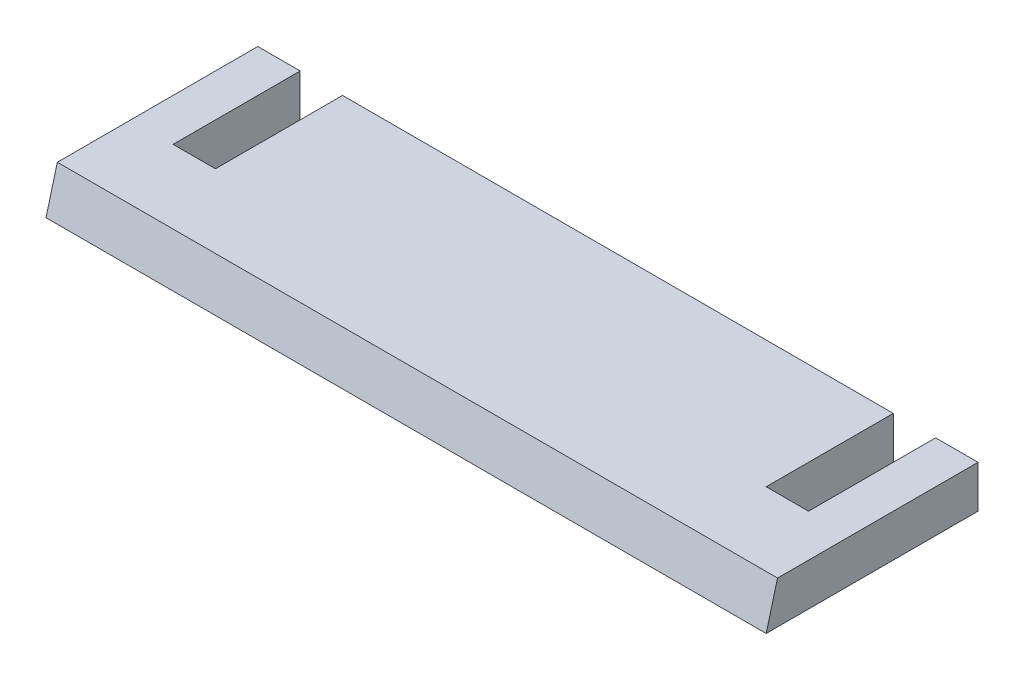
ISO-10303-21;
HEADER;
FILE_DESCRIPTION(('STEP AP214'),'2;1');
FILE_NAME('part.step','',(''),(''),'','','');
FILE_SCHEMA(('AUTOMOTIVE_DESIGN { 1 0 10303 214 1 1 1 1 }'));
ENDSEC;
DATA;
#1=APPLICATION_CONTEXT('core data for automotive mechanical design processes');
#2=APPLICATION_PROTOCOL_DEFINITION('international standard','automotive_design',2000,#1);
#3=PRODUCT_CONTEXT('',#1,'mechanical');
#4=PRODUCT('Part','Part','',(#3));
#5=PRODUCT_RELATED_PRODUCT_CATEGORY('part','',(#4));
#6=PRODUCT_DEFINITION_FORMATION('','',#4);
#7=PRODUCT_DEFINITION_CONTEXT('part definition',#1,'design');
#8=PRODUCT_DEFINITION('design','',#6,#7);
#9=PRODUCT_DEFINITION_SHAPE('','',#8);
#10=(LENGTH_UNIT() NAMED_UNIT(*) SI_UNIT(.MILLI.,.METRE.));
#11=(NAMED_UNIT(*) PLANE_ANGLE_UNIT() SI_UNIT($,.RADIAN.));
#12=(NAMED_UNIT(*) SI_UNIT($,.STERADIAN.) SOLID_ANGLE_UNIT());
#13=UNCERTAINTY_MEASURE_WITH_UNIT(LENGTH_MEASURE(1.E-05),#10,'distance_accuracy_value','');
#14=(GEOMETRIC_REPRESENTATION_CONTEXT(3) GLOBAL_UNCERTAINTY_ASSIGNED_CONTEXT((#13)) GLOBAL_UNIT_ASSIGNED_CONTEXT((#10,
#11,#12)) REPRESENTATION_CONTEXT('',''));
#15=CARTESIAN_POINT('',(0.,0.,0.));
#16=DIRECTION('',(0.,0.,1.));
#17=DIRECTION('',(1.,0.,0.));
#18=AXIS2_PLACEMENT_3D('',#15,#16,#17);
#19=CARTESIAN_POINT('',(85.,10.,-25.));
#20=DIRECTION('',(-1.,0.,0.));
#21=DIRECTION('',(0.,0.,1.));
#22=AXIS2_PLACEMENT_3D('',#19,#20,#21);
#23=PLANE('',#22);
#24=DIRECTION('',(0.,0.,-1.));
#25=VECTOR('',#24,1.);
#26=CARTESIAN_POINT('',(85.,0.,-25.));
#27=LINE('',#26,#25);
#28=CARTESIAN_POINT('',(85.,0.,25.));
#29=VERTEX_POINT('',#28);
#30=CARTESIAN_POINT('',(85.,0.,-25.));
#31=VERTEX_POINT('',#30);
#32=EDGE_CURVE('E151',#29,#31,#27,.T.);
#33=ORIENTED_EDGE('',*,*,#32,.T.);
#34=DIRECTION('',(0.,-1.,0.));
#35=VECTOR('',#34,1.);
#36=CARTESIAN_POINT('',(85.,10.,-25.));
#37=LINE('',#36,#35);
#38=CARTESIAN_POINT('',(85.,10.,-25.));
#39=VERTEX_POINT('',#38);
#40=EDGE_CURVE('E11',#39,#31,#37,.T.);
#41=ORIENTED_EDGE('',*,*,#40,.F.);
#42=DIRECTION('',(0.,0.,-1.));
#43=VECTOR('',#42,1.);
#44=CARTESIAN_POINT('',(85.,10.,-25.));
#45=LINE('',#44,#43);
#46=CARTESIAN_POINT('',(85.,10.,22.3205080756888));
#47=VERTEX_POINT('',#46);
#48=EDGE_CURVE('E141',#47,#39,#45,.T.);
#49=ORIENTED_EDGE('',*,*,#48,.F.);
#50=DIRECTION('',(0.,0.965925826289068,-0.258819045102521));
#51=VECTOR('',#50,1.);
#52=CARTESIAN_POINT('',(85.,21.8301270189222,19.1506350946109));
#53=LINE('',#52,#51);
#54=EDGE_CURVE('E46',#47,#29,#53,.F.);
#55=ORIENTED_EDGE('',*,*,#54,.T.);
#56=EDGE_LOOP('',(#33,#41,#49,#55));
#57=FACE_BOUND('',#56,.T.);
#58=ADVANCED_FACE('F42',(#57),#23,.F.);
#59=CARTESIAN_POINT('',(75.,10.,-25.));
#60=DIRECTION('',(0.,0.,1.));
#61=DIRECTION('',(1.,0.,0.));
#62=AXIS2_PLACEMENT_3D('',#59,#60,#61);
#63=PLANE('',#62);
#64=DIRECTION('',(-1.,0.,0.));
#65=VECTOR('',#64,1.);
#66=CARTESIAN_POINT('',(75.,0.,-25.));
#67=LINE('',#66,#65);
#68=CARTESIAN_POINT('',(75.,0.,-25.));
#69=VERTEX_POINT('',#68);
#70=EDGE_CURVE('E155',#31,#69,#67,.T.);
#71=ORIENTED_EDGE('',*,*,#70,.T.);
#72=DIRECTION('',(0.,-1.,0.));
#73=VECTOR('',#72,1.);
#74=CARTESIAN_POINT('',(75.,10.,-25.));
#75=LINE('',#74,#73);
#76=CARTESIAN_POINT('',(75.,10.,-25.));
#77=VERTEX_POINT('',#76);
#78=EDGE_CURVE('E52',#77,#69,#75,.T.);
#79=ORIENTED_EDGE('',*,*,#78,.F.);
#80=DIRECTION('',(-1.,0.,0.));
#81=VECTOR('',#80,1.);
#82=CARTESIAN_POINT('',(75.,10.,-25.));
#83=LINE('',#82,#81);
#84=EDGE_CURVE('E133',#39,#77,#83,.T.);
#85=ORIENTED_EDGE('',*,*,#84,.F.);
#86=ORIENTED_EDGE('',*,*,#40,.T.);
#87=EDGE_LOOP('',(#71,#79,#85,#86));
#88=FACE_BOUND('',#87,.T.);
#89=ADVANCED_FACE('F134',(#88),#63,.F.);
#90=CARTESIAN_POINT('',(75.,10.,-25.));
#91=DIRECTION('',(1.,0.,0.));
#92=DIRECTION('',(0.,0.,-1.));
#93=AXIS2_PLACEMENT_3D('',#90,#91,#92);
#94=PLANE('',#93);
#95=DIRECTION('',(0.,0.,1.));
#96=VECTOR('',#95,1.);
#97=CARTESIAN_POINT('',(75.,0.,-25.));
#98=LINE('',#97,#96);
#99=CARTESIAN_POINT('',(75.,0.,4.99999999999999));
#100=VERTEX_POINT('',#99);
#101=EDGE_CURVE('E158',#69,#100,#98,.T.);
#102=ORIENTED_EDGE('',*,*,#101,.T.);
#103=DIRECTION('',(0.,-1.,0.));
#104=VECTOR('',#103,1.);
#105=CARTESIAN_POINT('',(75.,10.,4.99999999999999));
#106=LINE('',#105,#104);
#107=CARTESIAN_POINT('',(75.,10.,4.99999999999999));
#108=VERTEX_POINT('',#107);
#109=EDGE_CURVE('E220',#108,#100,#106,.T.);
#110=ORIENTED_EDGE('',*,*,#109,.F.);
#111=DIRECTION('',(0.,0.,1.));
#112=VECTOR('',#111,1.);
#113=CARTESIAN_POINT('',(75.,10.,-25.));
#114=LINE('',#113,#112);
#115=EDGE_CURVE('E140',#77,#108,#114,.T.);
#116=ORIENTED_EDGE('',*,*,#115,.F.);
#117=ORIENTED_EDGE('',*,*,#78,.T.);
#118=EDGE_LOOP('',(#102,#110,#116,#117));
#119=FACE_BOUND('',#118,.T.);
#120=ADVANCED_FACE('F259',(#119),#94,.F.);
#121=CARTESIAN_POINT('',(75.,10.,4.99999999999999));
#122=DIRECTION('',(0.,0.,1.));
#123=DIRECTION('',(1.,0.,0.));
#124=AXIS2_PLACEMENT_3D('',#121,#122,#123);
#125=PLANE('',#124);
#126=DIRECTION('',(-1.,0.,0.));
#127=VECTOR('',#126,1.);
#128=CARTESIAN_POINT('',(75.,0.,4.99999999999999));
#129=LINE('',#128,#127);
#130=CARTESIAN_POINT('',(65.,0.,4.99999999999999));
#131=VERTEX_POINT('',#130);
#132=EDGE_CURVE('E165',#100,#131,#129,.T.);
#133=ORIENTED_EDGE('',*,*,#132,.T.);
#134=DIRECTION('',(0.,-1.,0.));
#135=VECTOR('',#134,1.);
#136=CARTESIAN_POINT('',(65.,10.,4.99999999999999));
#137=LINE('',#136,#135);
#138=CARTESIAN_POINT('',(65.,10.,4.99999999999999));
#139=VERTEX_POINT('',#138);
#140=EDGE_CURVE('E216',#139,#131,#137,.T.);
#141=ORIENTED_EDGE('',*,*,#140,.F.);
#142=DIRECTION('',(-1.,0.,0.));
#143=VECTOR('',#142,1.);
#144=CARTESIAN_POINT('',(75.,10.,4.99999999999999));
#145=LINE('',#144,#143);
#146=EDGE_CURVE('E251',#108,#139,#145,.T.);
#147=ORIENTED_EDGE('',*,*,#146,.F.);
#148=ORIENTED_EDGE('',*,*,#109,.T.);
#149=EDGE_LOOP('',(#133,#141,#147,#148));
#150=FACE_BOUND('',#149,.T.);
#151=ADVANCED_FACE('F263',(#150),#125,.F.);
#152=CARTESIAN_POINT('',(65.,10.,4.99999999999999));
#153=DIRECTION('',(-1.,0.,0.));
#154=DIRECTION('',(0.,0.,1.));
#155=AXIS2_PLACEMENT_3D('',#152,#153,#154);
#156=PLANE('',#155);
#157=DIRECTION('',(0.,0.,-1.));
#158=VECTOR('',#157,1.);
#159=CARTESIAN_POINT('',(65.,0.,4.99999999999999));
#160=LINE('',#159,#158);
#161=CARTESIAN_POINT('',(65.,0.,-25.));
#162=VERTEX_POINT('',#161);
#163=EDGE_CURVE('E168',#131,#162,#160,.T.);
#164=ORIENTED_EDGE('',*,*,#163,.T.);
#165=DIRECTION('',(0.,-1.,0.));
#166=VECTOR('',#165,1.);
#167=CARTESIAN_POINT('',(65.,10.,-25.));
#168=LINE('',#167,#166);
#169=CARTESIAN_POINT('',(65.,10.,-25.));
#170=VERTEX_POINT('',#169);
#171=EDGE_CURVE('E212',#170,#162,#168,.T.);
#172=ORIENTED_EDGE('',*,*,#171,.F.);
#173=DIRECTION('',(0.,0.,-1.));
#174=VECTOR('',#173,1.);
#175=CARTESIAN_POINT('',(65.,10.,4.99999999999999));
#176=LINE('',#175,#174);
#177=EDGE_CURVE('E248',#139,#170,#176,.T.);
#178=ORIENTED_EDGE('',*,*,#177,.F.);
#179=ORIENTED_EDGE('',*,*,#140,.T.);
#180=EDGE_LOOP('',(#164,#172,#178,#179));
#181=FACE_BOUND('',#180,.T.);
#182=ADVANCED_FACE('F268',(#181),#156,.F.);
#183=CARTESIAN_POINT('',(-65.,10.,-25.));
#184=DIRECTION('',(0.,0.,1.));
#185=DIRECTION('',(1.,0.,0.));
#186=AXIS2_PLACEMENT_3D('',#183,#184,#185);
#187=PLANE('',#186);
#188=DIRECTION('',(-1.,0.,0.));
#189=VECTOR('',#188,1.);
#190=CARTESIAN_POINT('',(-65.,0.,-25.));
#191=LINE('',#190,#189);
#192=CARTESIAN_POINT('',(-65.,0.,-25.));
#193=VERTEX_POINT('',#192);
#194=EDGE_CURVE('E171',#162,#193,#191,.T.);
#195=ORIENTED_EDGE('',*,*,#194,.T.);
#196=DIRECTION('',(0.,-1.,0.));
#197=VECTOR('',#196,1.);
#198=CARTESIAN_POINT('',(-65.,10.,-25.));
#199=LINE('',#198,#197);
#200=CARTESIAN_POINT('',(-65.,10.,-25.));
#201=VERTEX_POINT('',#200);
#202=EDGE_CURVE('E208',#201,#193,#199,.T.);
#203=ORIENTED_EDGE('',*,*,#202,.F.);
#204=DIRECTION('',(-1.,0.,0.));
#205=VECTOR('',#204,1.);
#206=CARTESIAN_POINT('',(-65.,10.,-25.));
#207=LINE('',#206,#205);
#208=EDGE_CURVE('E245',#170,#201,#207,.T.);
#209=ORIENTED_EDGE('',*,*,#208,.F.);
#210=ORIENTED_EDGE('',*,*,#171,.T.);
#211=EDGE_LOOP('',(#195,#203,#209,#210));
#212=FACE_BOUND('',#211,.T.);
#213=ADVANCED_FACE('F274',(#212),#187,.F.);
#214=CARTESIAN_POINT('',(-65.,10.,4.99999999999999));
#215=DIRECTION('',(1.,0.,0.));
#216=DIRECTION('',(0.,0.,-1.));
#217=AXIS2_PLACEMENT_3D('',#214,#215,#216);
#218=PLANE('',#217);
#219=DIRECTION('',(0.,0.,1.));
#220=VECTOR('',#219,1.);
#221=CARTESIAN_POINT('',(-65.,0.,4.99999999999999));
#222=LINE('',#221,#220);
#223=CARTESIAN_POINT('',(-65.,0.,4.99999999999999));
#224=VERTEX_POINT('',#223);
#225=EDGE_CURVE('E174',#193,#224,#222,.T.);
#226=ORIENTED_EDGE('',*,*,#225,.T.);
#227=DIRECTION('',(0.,-1.,0.));
#228=VECTOR('',#227,1.);
#229=CARTESIAN_POINT('',(-65.,10.,4.99999999999999));
#230=LINE('',#229,#228);
#231=CARTESIAN_POINT('',(-65.,10.,4.99999999999999));
#232=VERTEX_POINT('',#231);
#233=EDGE_CURVE('E204',#232,#224,#230,.T.);
#234=ORIENTED_EDGE('',*,*,#233,.F.);
#235=DIRECTION('',(0.,0.,1.));
#236=VECTOR('',#235,1.);
#237=CARTESIAN_POINT('',(-65.,10.,4.99999999999999));
#238=LINE('',#237,#236);
#239=EDGE_CURVE('E242',#201,#232,#238,.T.);
#240=ORIENTED_EDGE('',*,*,#239,.F.);
#241=ORIENTED_EDGE('',*,*,#202,.T.);
#242=EDGE_LOOP('',(#226,#234,#240,#241));
#243=FACE_BOUND('',#242,.T.);
#244=ADVANCED_FACE('F278',(#243),#218,.F.);
#245=CARTESIAN_POINT('',(-75.,10.,4.99999999999999));
#246=DIRECTION('',(0.,0.,1.));
#247=DIRECTION('',(1.,0.,0.));
#248=AXIS2_PLACEMENT_3D('',#245,#246,#247);
#249=PLANE('',#248);
#250=DIRECTION('',(-1.,0.,0.));
#251=VECTOR('',#250,1.);
#252=CARTESIAN_POINT('',(-75.,0.,4.99999999999999));
#253=LINE('',#252,#251);
#254=CARTESIAN_POINT('',(-75.,0.,4.99999999999999));
#255=VERTEX_POINT('',#254);
#256=EDGE_CURVE('E177',#224,#255,#253,.T.);
#257=ORIENTED_EDGE('',*,*,#256,.T.);
#258=DIRECTION('',(0.,-1.,0.));
#259=VECTOR('',#258,1.);
#260=CARTESIAN_POINT('',(-75.,10.,4.99999999999999));
#261=LINE('',#260,#259);
#262=CARTESIAN_POINT('',(-75.,10.,4.99999999999999));
#263=VERTEX_POINT('',#262);
#264=EDGE_CURVE('E200',#263,#255,#261,.T.);
#265=ORIENTED_EDGE('',*,*,#264,.F.);
#266=DIRECTION('',(-1.,0.,0.));
#267=VECTOR('',#266,1.);
#268=CARTESIAN_POINT('',(-75.,10.,4.99999999999999));
#269=LINE('',#268,#267);
#270=EDGE_CURVE('E237',#232,#263,#269,.T.);
#271=ORIENTED_EDGE('',*,*,#270,.F.);
#272=ORIENTED_EDGE('',*,*,#233,.T.);
#273=EDGE_LOOP('',(#257,#265,#271,#272));
#274=FACE_BOUND('',#273,.T.);
#275=ADVANCED_FACE('F283',(#274),#249,.F.);
#276=CARTESIAN_POINT('',(-75.,10.,-25.));
#277=DIRECTION('',(-1.,0.,0.));
#278=DIRECTION('',(0.,0.,1.));
#279=AXIS2_PLACEMENT_3D('',#276,#277,#278);
#280=PLANE('',#279);
#281=DIRECTION('',(0.,0.,-1.));
#282=VECTOR('',#281,1.);
#283=CARTESIAN_POINT('',(-75.,0.,-25.));
#284=LINE('',#283,#282);
#285=CARTESIAN_POINT('',(-75.,0.,-25.));
#286=VERTEX_POINT('',#285);
#287=EDGE_CURVE('E180',#255,#286,#284,.T.);
#288=ORIENTED_EDGE('',*,*,#287,.T.);
#289=DIRECTION('',(0.,-1.,0.));
#290=VECTOR('',#289,1.);
#291=CARTESIAN_POINT('',(-75.,10.,-25.));
#292=LINE('',#291,#290);
#293=CARTESIAN_POINT('',(-75.,10.,-25.));
#294=VERTEX_POINT('',#293);
#295=EDGE_CURVE('E195',#294,#286,#292,.T.);
#296=ORIENTED_EDGE('',*,*,#295,.F.);
#297=DIRECTION('',(0.,0.,-1.));
#298=VECTOR('',#297,1.);
#299=CARTESIAN_POINT('',(-75.,10.,-25.));
#300=LINE('',#299,#298);
#301=EDGE_CURVE('E233',#263,#294,#300,.T.);
#302=ORIENTED_EDGE('',*,*,#301,.F.);
#303=ORIENTED_EDGE('',*,*,#264,.T.);
#304=EDGE_LOOP('',(#288,#296,#302,#303));
#305=FACE_BOUND('',#304,.T.);
#306=ADVANCED_FACE('F287',(#305),#280,.F.);
#307=CARTESIAN_POINT('',(-85.,10.,-25.));
#308=DIRECTION('',(0.,0.,1.));
#309=DIRECTION('',(1.,0.,0.));
#310=AXIS2_PLACEMENT_3D('',#307,#308,#309);
#311=PLANE('',#310);
#312=DIRECTION('',(-1.,0.,0.));
#313=VECTOR('',#312,1.);
#314=CARTESIAN_POINT('',(-85.,0.,-25.));
#315=LINE('',#314,#313);
#316=CARTESIAN_POINT('',(-85.,0.,-25.));
#317=VERTEX_POINT('',#316);
#318=EDGE_CURVE('E183',#286,#317,#315,.T.);
#319=ORIENTED_EDGE('',*,*,#318,.T.);
#320=DIRECTION('',(0.,-1.,0.));
#321=VECTOR('',#320,1.);
#322=CARTESIAN_POINT('',(-85.,10.,-25.));
#323=LINE('',#322,#321);
#324=CARTESIAN_POINT('',(-85.,10.,-25.));
#325=VERTEX_POINT('',#324);
#326=EDGE_CURVE('E191',#325,#317,#323,.T.);
#327=ORIENTED_EDGE('',*,*,#326,.F.);
#328=DIRECTION('',(-1.,0.,0.));
#329=VECTOR('',#328,1.);
#330=CARTESIAN_POINT('',(-85.,10.,-25.));
#331=LINE('',#330,#329);
#332=EDGE_CURVE('E231',#294,#325,#331,.T.);
#333=ORIENTED_EDGE('',*,*,#332,.F.);
#334=ORIENTED_EDGE('',*,*,#295,.T.);
#335=EDGE_LOOP('',(#319,#327,#333,#334));
#336=FACE_BOUND('',#335,.T.);
#337=ADVANCED_FACE('F291',(#336),#311,.F.);
#338=CARTESIAN_POINT('',(-85.,10.,-25.));
#339=DIRECTION('',(1.,0.,0.));
#340=DIRECTION('',(0.,0.,-1.));
#341=AXIS2_PLACEMENT_3D('',#338,#339,#340);
#342=PLANE('',#341);
#343=DIRECTION('',(0.,0.,1.));
#344=VECTOR('',#343,1.);
#345=CARTESIAN_POINT('',(-85.,0.,-25.));
#346=LINE('',#345,#344);
#347=CARTESIAN_POINT('',(-85.,0.,25.));
#348=VERTEX_POINT('',#347);
#349=EDGE_CURVE('E186',#317,#348,#346,.T.);
#350=ORIENTED_EDGE('',*,*,#349,.T.);
#351=DIRECTION('',(0.,0.965925826289068,-0.258819045102521));
#352=VECTOR('',#351,1.);
#353=CARTESIAN_POINT('',(-85.,0.,25.));
#354=LINE('',#353,#352);
#355=CARTESIAN_POINT('',(-85.,10.,22.3205080756888));
#356=VERTEX_POINT('',#355);
#357=EDGE_CURVE('E196',#356,#348,#354,.F.);
#358=ORIENTED_EDGE('',*,*,#357,.F.);
#359=DIRECTION('',(0.,0.,1.));
#360=VECTOR('',#359,1.);
#361=CARTESIAN_POINT('',(-85.,10.,-25.));
#362=LINE('',#361,#360);
#363=EDGE_CURVE('E65',#325,#356,#362,.T.);
#364=ORIENTED_EDGE('',*,*,#363,.F.);
#365=ORIENTED_EDGE('',*,*,#326,.T.);
#366=EDGE_LOOP('',(#350,#358,#364,#365));
#367=FACE_BOUND('',#366,.T.);
#368=ADVANCED_FACE('F294',(#367),#342,.F.);
#369=CARTESIAN_POINT('',(-85.,0.,25.));
#370=DIRECTION('',(0.,0.258819045102521,0.965925826289068));
#371=DIRECTION('',(0.,-0.965925826289068,0.258819045102521));
#372=AXIS2_PLACEMENT_3D('',#369,#370,#371);
#373=PLANE('',#372);
#374=DIRECTION('',(1.,0.,0.));
#375=VECTOR('',#374,1.);
#376=CARTESIAN_POINT('',(-85.,0.,25.));
#377=LINE('',#376,#375);
#378=EDGE_CURVE('E148',#348,#29,#377,.T.);
#379=ORIENTED_EDGE('',*,*,#378,.T.);
#380=ORIENTED_EDGE('',*,*,#54,.F.);
#381=DIRECTION('',(-1.,0.,0.));
#382=VECTOR('',#381,1.);
#383=CARTESIAN_POINT('',(-85.,10.,22.3205080756888));
#384=LINE('',#383,#382);
#385=EDGE_CURVE('E60',#356,#47,#384,.F.);
#386=ORIENTED_EDGE('',*,*,#385,.F.);
#387=ORIENTED_EDGE('',*,*,#357,.T.);
#388=EDGE_LOOP('',(#379,#380,#386,#387));
#389=FACE_BOUND('',#388,.T.);
#390=ADVANCED_FACE('F44',(#389),#373,.T.);
#391=CARTESIAN_POINT('',(0.,10.,0.));
#392=DIRECTION('',(0.,1.,0.));
#393=DIRECTION('',(0.,0.,1.));
#394=AXIS2_PLACEMENT_3D('',#391,#392,#393);
#395=PLANE('',#394);
#396=ORIENTED_EDGE('',*,*,#48,.T.);
#397=ORIENTED_EDGE('',*,*,#84,.T.);
#398=ORIENTED_EDGE('',*,*,#115,.T.);
#399=ORIENTED_EDGE('',*,*,#146,.T.);
#400=ORIENTED_EDGE('',*,*,#177,.T.);
#401=ORIENTED_EDGE('',*,*,#208,.T.);
#402=ORIENTED_EDGE('',*,*,#239,.T.);
#403=ORIENTED_EDGE('',*,*,#270,.T.);
#404=ORIENTED_EDGE('',*,*,#301,.T.);
#405=ORIENTED_EDGE('',*,*,#332,.T.);
#406=ORIENTED_EDGE('',*,*,#363,.T.);
#407=ORIENTED_EDGE('',*,*,#385,.T.);
#408=EDGE_LOOP('',(#396,#397,#398,#399,#400,#401,#402,#403,#404,#405,#406,#407));
#409=FACE_BOUND('',#408,.T.);
#410=ADVANCED_FACE('F144',(#409),#395,.T.);
#411=CARTESIAN_POINT('',(0.,0.,0.));
#412=DIRECTION('',(0.,1.,0.));
#413=DIRECTION('',(0.,0.,1.));
#414=AXIS2_PLACEMENT_3D('',#411,#412,#413);
#415=PLANE('',#414);
#416=ORIENTED_EDGE('',*,*,#32,.F.);
#417=ORIENTED_EDGE('',*,*,#378,.F.);
#418=ORIENTED_EDGE('',*,*,#349,.F.);
#419=ORIENTED_EDGE('',*,*,#318,.F.);
#420=ORIENTED_EDGE('',*,*,#287,.F.);
#421=ORIENTED_EDGE('',*,*,#256,.F.);
#422=ORIENTED_EDGE('',*,*,#225,.F.);
#423=ORIENTED_EDGE('',*,*,#194,.F.);
#424=ORIENTED_EDGE('',*,*,#163,.F.);
#425=ORIENTED_EDGE('',*,*,#132,.F.);
#426=ORIENTED_EDGE('',*,*,#101,.F.);
#427=ORIENTED_EDGE('',*,*,#70,.F.);
#428=EDGE_LOOP('',(#416,#417,#418,#419,#420,#421,#422,#423,#424,#425,#426,#427));
#429=FACE_BOUND('',#428,.T.);
#430=ADVANCED_FACE('F296',(#429),#415,.F.);
#431=CLOSED_SHELL('',(#58,#89,#120,#151,#182,#213,#244,#275,#306,#337,#368,#390,#410,#430));
#432=MANIFOLD_SOLID_BREP('B2',#431);
#433=ADVANCED_BREP_SHAPE_REPRESENTATION('',(#18,#432),#14);
#434=SHAPE_DEFINITION_REPRESENTATION(#9,#433);
ENDSEC;
END-ISO-10303-21;
